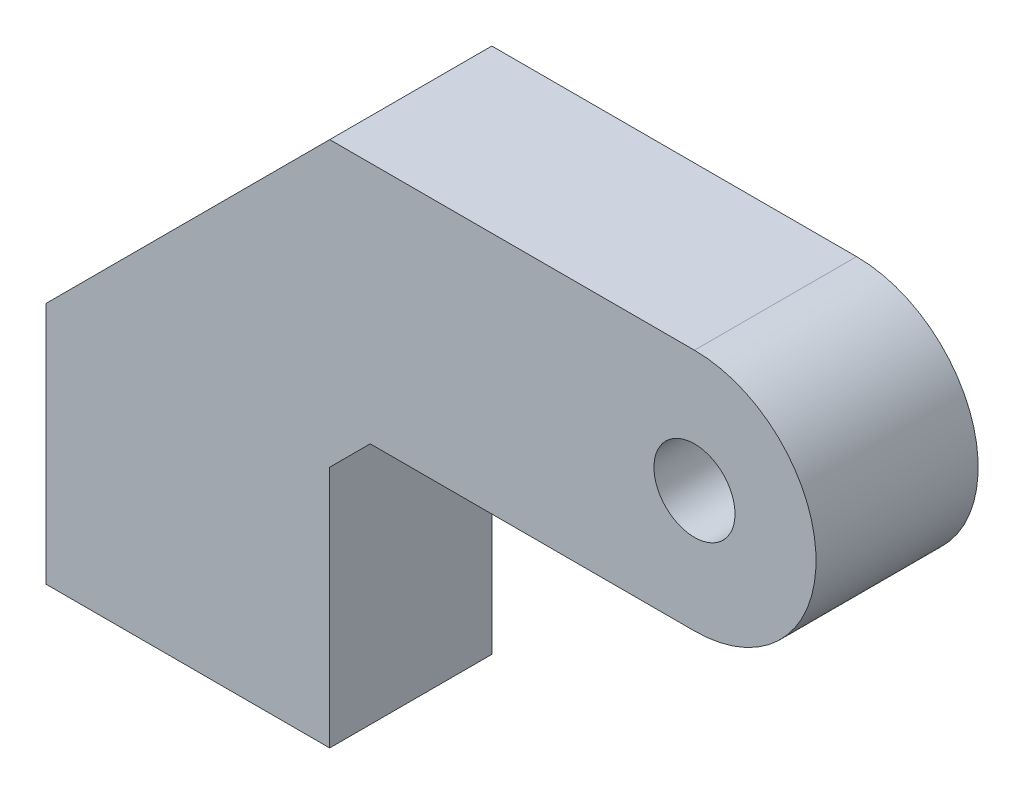
ISO-10303-21;
HEADER;
FILE_DESCRIPTION(('STEP AP214'),'2;1');
FILE_NAME('part.step','',(''),(''),'','','');
FILE_SCHEMA(('AUTOMOTIVE_DESIGN { 1 0 10303 214 1 1 1 1 }'));
ENDSEC;
DATA;
#1=APPLICATION_CONTEXT('core data for automotive mechanical design processes');
#2=APPLICATION_PROTOCOL_DEFINITION('international standard','automotive_design',2000,#1);
#3=PRODUCT_CONTEXT('',#1,'mechanical');
#4=PRODUCT('Part','Part','',(#3));
#5=PRODUCT_RELATED_PRODUCT_CATEGORY('part','',(#4));
#6=PRODUCT_DEFINITION_FORMATION('','',#4);
#7=PRODUCT_DEFINITION_CONTEXT('part definition',#1,'design');
#8=PRODUCT_DEFINITION('design','',#6,#7);
#9=PRODUCT_DEFINITION_SHAPE('','',#8);
#10=(LENGTH_UNIT() NAMED_UNIT(*) SI_UNIT(.MILLI.,.METRE.));
#11=(NAMED_UNIT(*) PLANE_ANGLE_UNIT() SI_UNIT($,.RADIAN.));
#12=(NAMED_UNIT(*) SI_UNIT($,.STERADIAN.) SOLID_ANGLE_UNIT());
#13=UNCERTAINTY_MEASURE_WITH_UNIT(LENGTH_MEASURE(1.E-05),#10,'distance_accuracy_value','');
#14=(GEOMETRIC_REPRESENTATION_CONTEXT(3) GLOBAL_UNCERTAINTY_ASSIGNED_CONTEXT((#13)) GLOBAL_UNIT_ASSIGNED_CONTEXT((#10,
#11,#12)) REPRESENTATION_CONTEXT('',''));
#15=CARTESIAN_POINT('',(0.,0.,0.));
#16=DIRECTION('',(0.,0.,1.));
#17=DIRECTION('',(1.,0.,0.));
#18=AXIS2_PLACEMENT_3D('',#15,#16,#17);
#19=CARTESIAN_POINT('',(7.,0.,8.));
#20=DIRECTION('',(-1.,0.,0.));
#21=DIRECTION('',(0.,-1.,0.));
#22=AXIS2_PLACEMENT_3D('',#19,#20,#21);
#23=PLANE('',#22);
#24=DIRECTION('',(0.,1.,0.));
#25=VECTOR('',#24,1.);
#26=CARTESIAN_POINT('',(7.,0.,0.));
#27=LINE('',#26,#25);
#28=CARTESIAN_POINT('',(7.,0.,0.));
#29=VERTEX_POINT('',#28);
#30=CARTESIAN_POINT('',(7.,12.,0.));
#31=VERTEX_POINT('',#30);
#32=EDGE_CURVE('E137',#29,#31,#27,.T.);
#33=ORIENTED_EDGE('',*,*,#32,.T.);
#34=DIRECTION('',(0.,0.,1.));
#35=VECTOR('',#34,1.);
#36=CARTESIAN_POINT('',(7.,12.,8.));
#37=LINE('',#36,#35);
#38=CARTESIAN_POINT('',(7.,12.,8.));
#39=VERTEX_POINT('',#38);
#40=EDGE_CURVE('E171',#31,#39,#37,.T.);
#41=ORIENTED_EDGE('',*,*,#40,.T.);
#42=DIRECTION('',(0.,1.,0.));
#43=VECTOR('',#42,1.);
#44=CARTESIAN_POINT('',(7.,0.,8.));
#45=LINE('',#44,#43);
#46=CARTESIAN_POINT('',(7.,0.,8.));
#47=VERTEX_POINT('',#46);
#48=EDGE_CURVE('E140',#47,#39,#45,.T.);
#49=ORIENTED_EDGE('',*,*,#48,.F.);
#50=DIRECTION('',(0.,0.,-1.));
#51=VECTOR('',#50,1.);
#52=CARTESIAN_POINT('',(7.,0.,8.));
#53=LINE('',#52,#51);
#54=EDGE_CURVE('E149',#47,#29,#53,.T.);
#55=ORIENTED_EDGE('',*,*,#54,.T.);
#56=EDGE_LOOP('',(#33,#41,#49,#55));
#57=FACE_BOUND('',#56,.T.);
#58=ADVANCED_FACE('F33',(#57),#23,.F.);
#59=CARTESIAN_POINT('',(7.,26.,8.));
#60=DIRECTION('',(0.,-1.,0.));
#61=DIRECTION('',(0.,0.,-1.));
#62=AXIS2_PLACEMENT_3D('',#59,#60,#61);
#63=PLANE('',#62);
#64=DIRECTION('',(-1.,0.,0.));
#65=VECTOR('',#64,1.);
#66=CARTESIAN_POINT('',(7.,26.,8.));
#67=LINE('',#66,#65);
#68=CARTESIAN_POINT('',(25.,26.,8.));
#69=VERTEX_POINT('',#68);
#70=CARTESIAN_POINT('',(7.00000000000004,26.,8.));
#71=VERTEX_POINT('',#70);
#72=EDGE_CURVE('E142',#69,#71,#67,.T.);
#73=ORIENTED_EDGE('',*,*,#72,.F.);
#74=DIRECTION('',(0.,0.,1.));
#75=VECTOR('',#74,1.);
#76=CARTESIAN_POINT('',(25.,26.,0.));
#77=LINE('',#76,#75);
#78=CARTESIAN_POINT('',(25.,26.,0.));
#79=VERTEX_POINT('',#78);
#80=EDGE_CURVE('E111',#79,#69,#77,.T.);
#81=ORIENTED_EDGE('',*,*,#80,.F.);
#82=DIRECTION('',(-1.,0.,0.));
#83=VECTOR('',#82,1.);
#84=CARTESIAN_POINT('',(7.,26.,0.));
#85=LINE('',#84,#83);
#86=CARTESIAN_POINT('',(7.00000000000004,26.,0.));
#87=VERTEX_POINT('',#86);
#88=EDGE_CURVE('E116',#79,#87,#85,.T.);
#89=ORIENTED_EDGE('',*,*,#88,.T.);
#90=DIRECTION('',(0.,0.,1.));
#91=VECTOR('',#90,1.);
#92=CARTESIAN_POINT('',(7.00000000000004,26.,8.));
#93=LINE('',#92,#91);
#94=EDGE_CURVE('E166',#87,#71,#93,.T.);
#95=ORIENTED_EDGE('',*,*,#94,.T.);
#96=EDGE_LOOP('',(#73,#81,#89,#95));
#97=FACE_BOUND('',#96,.T.);
#98=ADVANCED_FACE('F196',(#97),#63,.F.);
#99=CARTESIAN_POINT('',(-7.,0.,8.));
#100=DIRECTION('',(1.,0.,0.));
#101=DIRECTION('',(0.,1.,0.));
#102=AXIS2_PLACEMENT_3D('',#99,#100,#101);
#103=PLANE('',#102);
#104=DIRECTION('',(0.,-1.,0.));
#105=VECTOR('',#104,1.);
#106=CARTESIAN_POINT('',(-7.,0.,8.));
#107=LINE('',#106,#105);
#108=CARTESIAN_POINT('',(-7.,12.,8.));
#109=VERTEX_POINT('',#108);
#110=CARTESIAN_POINT('',(-7.,0.,8.));
#111=VERTEX_POINT('',#110);
#112=EDGE_CURVE('E145',#109,#111,#107,.T.);
#113=ORIENTED_EDGE('',*,*,#112,.F.);
#114=DIRECTION('',(0.,0.,-1.));
#115=VECTOR('',#114,1.);
#116=CARTESIAN_POINT('',(-7.,12.,8.));
#117=LINE('',#116,#115);
#118=CARTESIAN_POINT('',(-7.,12.,0.));
#119=VERTEX_POINT('',#118);
#120=EDGE_CURVE('E161',#109,#119,#117,.T.);
#121=ORIENTED_EDGE('',*,*,#120,.T.);
#122=DIRECTION('',(0.,-1.,0.));
#123=VECTOR('',#122,1.);
#124=CARTESIAN_POINT('',(-7.,0.,0.));
#125=LINE('',#124,#123);
#126=CARTESIAN_POINT('',(-7.,0.,0.));
#127=VERTEX_POINT('',#126);
#128=EDGE_CURVE('E153',#119,#127,#125,.T.);
#129=ORIENTED_EDGE('',*,*,#128,.T.);
#130=DIRECTION('',(0.,0.,-1.));
#131=VECTOR('',#130,1.);
#132=CARTESIAN_POINT('',(-7.,0.,8.));
#133=LINE('',#132,#131);
#134=EDGE_CURVE('E158',#111,#127,#133,.T.);
#135=ORIENTED_EDGE('',*,*,#134,.F.);
#136=EDGE_LOOP('',(#113,#121,#129,#135));
#137=FACE_BOUND('',#136,.T.);
#138=ADVANCED_FACE('F201',(#137),#103,.F.);
#139=CARTESIAN_POINT('',(-7.,0.,8.));
#140=DIRECTION('',(0.,1.,0.));
#141=DIRECTION('',(-1.,0.,0.));
#142=AXIS2_PLACEMENT_3D('',#139,#140,#141);
#143=PLANE('',#142);
#144=CARTESIAN_POINT('',(4.,0.,4.));
#145=DIRECTION('',(0.,-1.,0.));
#146=DIRECTION('',(-1.,0.,0.));
#147=AXIS2_PLACEMENT_3D('',#144,#145,#146);
#148=CIRCLE('',#147,1.25);
#149=CARTESIAN_POINT('',(2.75,0.,4.));
#150=VERTEX_POINT('',#149);
#151=EDGE_CURVE('E101',#150,#150,#148,.T.);
#152=ORIENTED_EDGE('',*,*,#151,.F.);
#153=EDGE_LOOP('',(#152));
#154=FACE_BOUND('',#153,.T.);
#155=CARTESIAN_POINT('',(-4.,0.,4.));
#156=DIRECTION('',(0.,-1.,0.));
#157=DIRECTION('',(1.,0.,0.));
#158=AXIS2_PLACEMENT_3D('',#155,#156,#157);
#159=CIRCLE('',#158,1.25);
#160=CARTESIAN_POINT('',(-2.75,0.,4.));
#161=VERTEX_POINT('',#160);
#162=EDGE_CURVE('E131',#161,#161,#159,.T.);
#163=ORIENTED_EDGE('',*,*,#162,.F.);
#164=EDGE_LOOP('',(#163));
#165=FACE_BOUND('',#164,.T.);
#166=DIRECTION('',(1.,0.,0.));
#167=VECTOR('',#166,1.);
#168=CARTESIAN_POINT('',(-7.,0.,0.));
#169=LINE('',#168,#167);
#170=EDGE_CURVE('E143',#127,#29,#169,.T.);
#171=ORIENTED_EDGE('',*,*,#170,.T.);
#172=ORIENTED_EDGE('',*,*,#54,.F.);
#173=DIRECTION('',(1.,0.,0.));
#174=VECTOR('',#173,1.);
#175=CARTESIAN_POINT('',(-7.,0.,8.));
#176=LINE('',#175,#174);
#177=EDGE_CURVE('E147',#111,#47,#176,.T.);
#178=ORIENTED_EDGE('',*,*,#177,.F.);
#179=ORIENTED_EDGE('',*,*,#134,.T.);
#180=EDGE_LOOP('',(#171,#172,#178,#179));
#181=FACE_BOUND('',#180,.T.);
#182=ADVANCED_FACE('F186',(#154,#165,#181),#143,.F.);
#183=CARTESIAN_POINT('',(0.,0.,8.));
#184=DIRECTION('',(0.,0.,1.));
#185=DIRECTION('',(1.,0.,0.));
#186=AXIS2_PLACEMENT_3D('',#183,#184,#185);
#187=PLANE('',#186);
#188=CARTESIAN_POINT('',(25.,20.,8.));
#189=DIRECTION('',(0.,0.,-1.));
#190=DIRECTION('',(-1.,0.,0.));
#191=AXIS2_PLACEMENT_3D('',#188,#189,#190);
#192=CIRCLE('',#191,6.00000000000001);
#193=CARTESIAN_POINT('',(25.,14.,8.));
#194=VERTEX_POINT('',#193);
#195=EDGE_CURVE('E110',#69,#194,#192,.T.);
#196=ORIENTED_EDGE('',*,*,#195,.F.);
#197=ORIENTED_EDGE('',*,*,#72,.T.);
#198=DIRECTION('',(0.707106781186549,0.707106781186546,0.));
#199=VECTOR('',#198,1.);
#200=CARTESIAN_POINT('',(-9.49999999999999,9.50000000000002,8.));
#201=LINE('',#200,#199);
#202=EDGE_CURVE('E169',#71,#109,#201,.F.);
#203=ORIENTED_EDGE('',*,*,#202,.T.);
#204=ORIENTED_EDGE('',*,*,#112,.T.);
#205=ORIENTED_EDGE('',*,*,#177,.T.);
#206=ORIENTED_EDGE('',*,*,#48,.T.);
#207=DIRECTION('',(0.707106781186543,0.707106781186552,0.));
#208=VECTOR('',#207,1.);
#209=CARTESIAN_POINT('',(7.,12.,8.));
#210=LINE('',#209,#208);
#211=CARTESIAN_POINT('',(9.,14.,8.));
#212=VERTEX_POINT('',#211);
#213=EDGE_CURVE('E41',#39,#212,#210,.T.);
#214=ORIENTED_EDGE('',*,*,#213,.T.);
#215=DIRECTION('',(1.,0.,0.));
#216=VECTOR('',#215,1.);
#217=CARTESIAN_POINT('',(7.,14.,8.));
#218=LINE('',#217,#216);
#219=EDGE_CURVE('E102',#212,#194,#218,.T.);
#220=ORIENTED_EDGE('',*,*,#219,.T.);
#221=EDGE_LOOP('',(#196,#197,#203,#204,#205,#206,#214,#220));
#222=FACE_BOUND('',#221,.T.);
#223=CARTESIAN_POINT('',(25.,20.,8.));
#224=DIRECTION('',(0.,0.,1.));
#225=DIRECTION('',(1.,0.,0.));
#226=AXIS2_PLACEMENT_3D('',#223,#224,#225);
#227=CIRCLE('',#226,2.);
#228=CARTESIAN_POINT('',(27.,20.,8.));
#229=VERTEX_POINT('',#228);
#230=EDGE_CURVE('E120',#229,#229,#227,.T.);
#231=ORIENTED_EDGE('',*,*,#230,.F.);
#232=EDGE_LOOP('',(#231));
#233=FACE_BOUND('',#232,.T.);
#234=ADVANCED_FACE('F179',(#222,#233),#187,.T.);
#235=CARTESIAN_POINT('',(0.,0.,0.));
#236=DIRECTION('',(0.,0.,1.));
#237=DIRECTION('',(1.,0.,0.));
#238=AXIS2_PLACEMENT_3D('',#235,#236,#237);
#239=PLANE('',#238);
#240=CARTESIAN_POINT('',(25.,20.,0.));
#241=DIRECTION('',(0.,0.,1.));
#242=DIRECTION('',(1.,0.,0.));
#243=AXIS2_PLACEMENT_3D('',#240,#241,#242);
#244=CIRCLE('',#243,2.);
#245=CARTESIAN_POINT('',(27.,20.,0.));
#246=VERTEX_POINT('',#245);
#247=EDGE_CURVE('E122',#246,#246,#244,.T.);
#248=ORIENTED_EDGE('',*,*,#247,.T.);
#249=EDGE_LOOP('',(#248));
#250=FACE_BOUND('',#249,.T.);
#251=ORIENTED_EDGE('',*,*,#88,.F.);
#252=CARTESIAN_POINT('',(25.,20.,0.));
#253=DIRECTION('',(0.,0.,-1.));
#254=DIRECTION('',(-1.,0.,0.));
#255=AXIS2_PLACEMENT_3D('',#252,#253,#254);
#256=CIRCLE('',#255,6.00000000000001);
#257=CARTESIAN_POINT('',(25.,14.,0.));
#258=VERTEX_POINT('',#257);
#259=EDGE_CURVE('E108',#79,#258,#256,.T.);
#260=ORIENTED_EDGE('',*,*,#259,.T.);
#261=DIRECTION('',(1.,0.,0.));
#262=VECTOR('',#261,1.);
#263=CARTESIAN_POINT('',(7.,14.,0.));
#264=LINE('',#263,#262);
#265=CARTESIAN_POINT('',(9.,14.,0.));
#266=VERTEX_POINT('',#265);
#267=EDGE_CURVE('E94',#266,#258,#264,.T.);
#268=ORIENTED_EDGE('',*,*,#267,.F.);
#269=DIRECTION('',(-0.707106781186543,-0.707106781186552,0.));
#270=VECTOR('',#269,1.);
#271=CARTESIAN_POINT('',(-2.49999999999994,2.49999999999991,0.));
#272=LINE('',#271,#270);
#273=EDGE_CURVE('E11',#266,#31,#272,.T.);
#274=ORIENTED_EDGE('',*,*,#273,.T.);
#275=ORIENTED_EDGE('',*,*,#32,.F.);
#276=ORIENTED_EDGE('',*,*,#170,.F.);
#277=ORIENTED_EDGE('',*,*,#128,.F.);
#278=DIRECTION('',(-0.707106781186549,-0.707106781186546,0.));
#279=VECTOR('',#278,1.);
#280=CARTESIAN_POINT('',(-7.,12.,0.));
#281=LINE('',#280,#279);
#282=EDGE_CURVE('E164',#119,#87,#281,.F.);
#283=ORIENTED_EDGE('',*,*,#282,.T.);
#284=EDGE_LOOP('',(#251,#260,#268,#274,#275,#276,#277,#283));
#285=FACE_BOUND('',#284,.T.);
#286=ADVANCED_FACE('F114',(#250,#285),#239,.F.);
#287=CARTESIAN_POINT('',(-4.,10.,4.));
#288=DIRECTION('',(0.,-1.,0.));
#289=DIRECTION('',(1.,0.,0.));
#290=AXIS2_PLACEMENT_3D('',#287,#288,#289);
#291=CYLINDRICAL_SURFACE('',#290,1.25);
#292=CARTESIAN_POINT('',(-4.,10.,4.));
#293=DIRECTION('',(0.,-1.,0.));
#294=DIRECTION('',(1.,0.,0.));
#295=AXIS2_PLACEMENT_3D('',#292,#293,#294);
#296=CIRCLE('',#295,1.25);
#297=CARTESIAN_POINT('',(-2.75,10.,4.));
#298=VERTEX_POINT('',#297);
#299=EDGE_CURVE('E134',#298,#298,#296,.T.);
#300=ORIENTED_EDGE('',*,*,#299,.F.);
#301=EDGE_LOOP('',(#300));
#302=FACE_BOUND('',#301,.T.);
#303=ORIENTED_EDGE('',*,*,#162,.T.);
#304=EDGE_LOOP('',(#303));
#305=FACE_BOUND('',#304,.T.);
#306=ADVANCED_FACE('F227',(#302,#305),#291,.F.);
#307=CARTESIAN_POINT('',(-4.,10.,4.));
#308=DIRECTION('',(0.,-1.,0.));
#309=DIRECTION('',(1.,0.,0.));
#310=AXIS2_PLACEMENT_3D('',#307,#308,#309);
#311=PLANE('',#310);
#312=ORIENTED_EDGE('',*,*,#299,.T.);
#313=EDGE_LOOP('',(#312));
#314=FACE_BOUND('',#313,.T.);
#315=ADVANCED_FACE('F233',(#314),#311,.T.);
#316=CARTESIAN_POINT('',(4.,10.,4.));
#317=DIRECTION('',(0.,-1.,0.));
#318=DIRECTION('',(1.,0.,0.));
#319=AXIS2_PLACEMENT_3D('',#316,#317,#318);
#320=CYLINDRICAL_SURFACE('',#319,1.25);
#321=CARTESIAN_POINT('',(4.,10.,4.));
#322=DIRECTION('',(0.,-1.,0.));
#323=DIRECTION('',(-1.,0.,0.));
#324=AXIS2_PLACEMENT_3D('',#321,#322,#323);
#325=CIRCLE('',#324,1.25);
#326=CARTESIAN_POINT('',(2.75,10.,4.));
#327=VERTEX_POINT('',#326);
#328=EDGE_CURVE('E128',#327,#327,#325,.T.);
#329=ORIENTED_EDGE('',*,*,#328,.F.);
#330=EDGE_LOOP('',(#329));
#331=FACE_BOUND('',#330,.T.);
#332=ORIENTED_EDGE('',*,*,#151,.T.);
#333=EDGE_LOOP('',(#332));
#334=FACE_BOUND('',#333,.T.);
#335=ADVANCED_FACE('F237',(#331,#334),#320,.F.);
#336=CARTESIAN_POINT('',(4.,10.,4.));
#337=DIRECTION('',(0.,1.,0.));
#338=DIRECTION('',(-1.,0.,0.));
#339=AXIS2_PLACEMENT_3D('',#336,#337,#338);
#340=PLANE('',#339);
#341=ORIENTED_EDGE('',*,*,#328,.T.);
#342=EDGE_LOOP('',(#341));
#343=FACE_BOUND('',#342,.T.);
#344=ADVANCED_FACE('F241',(#343),#340,.F.);
#345=CARTESIAN_POINT('',(7.,14.,0.));
#346=DIRECTION('',(0.,-1.,0.));
#347=DIRECTION('',(1.,0.,0.));
#348=AXIS2_PLACEMENT_3D('',#345,#346,#347);
#349=PLANE('',#348);
#350=ORIENTED_EDGE('',*,*,#219,.F.);
#351=DIRECTION('',(0.,0.,-1.));
#352=VECTOR('',#351,1.);
#353=CARTESIAN_POINT('',(9.,14.,0.));
#354=LINE('',#353,#352);
#355=EDGE_CURVE('E48',#212,#266,#354,.T.);
#356=ORIENTED_EDGE('',*,*,#355,.T.);
#357=ORIENTED_EDGE('',*,*,#267,.T.);
#358=DIRECTION('',(0.,0.,1.));
#359=VECTOR('',#358,1.);
#360=CARTESIAN_POINT('',(25.,14.,0.));
#361=LINE('',#360,#359);
#362=EDGE_CURVE('E97',#258,#194,#361,.T.);
#363=ORIENTED_EDGE('',*,*,#362,.T.);
#364=EDGE_LOOP('',(#350,#356,#357,#363));
#365=FACE_BOUND('',#364,.T.);
#366=ADVANCED_FACE('F96',(#365),#349,.T.);
#367=CARTESIAN_POINT('',(25.,20.,0.));
#368=DIRECTION('',(0.,0.,1.));
#369=DIRECTION('',(1.,0.,0.));
#370=AXIS2_PLACEMENT_3D('',#367,#368,#369);
#371=CYLINDRICAL_SURFACE('',#370,2.);
#372=ORIENTED_EDGE('',*,*,#247,.F.);
#373=EDGE_LOOP('',(#372));
#374=FACE_BOUND('',#373,.T.);
#375=ORIENTED_EDGE('',*,*,#230,.T.);
#376=EDGE_LOOP('',(#375));
#377=FACE_BOUND('',#376,.T.);
#378=ADVANCED_FACE('F206',(#374,#377),#371,.F.);
#379=CARTESIAN_POINT('',(-7.,12.,8.));
#380=DIRECTION('',(0.707106781186546,-0.707106781186549,0.));
#381=DIRECTION('',(0.,0.,-1.));
#382=AXIS2_PLACEMENT_3D('',#379,#380,#381);
#383=PLANE('',#382);
#384=ORIENTED_EDGE('',*,*,#202,.F.);
#385=ORIENTED_EDGE('',*,*,#94,.F.);
#386=ORIENTED_EDGE('',*,*,#282,.F.);
#387=ORIENTED_EDGE('',*,*,#120,.F.);
#388=EDGE_LOOP('',(#384,#385,#386,#387));
#389=FACE_BOUND('',#388,.T.);
#390=ADVANCED_FACE('F193',(#389),#383,.F.);
#391=CARTESIAN_POINT('',(25.,20.,0.));
#392=DIRECTION('',(0.,0.,1.));
#393=DIRECTION('',(1.,0.,0.));
#394=AXIS2_PLACEMENT_3D('',#391,#392,#393);
#395=CYLINDRICAL_SURFACE('',#394,6.00000000000001);
#396=ORIENTED_EDGE('',*,*,#195,.T.);
#397=ORIENTED_EDGE('',*,*,#362,.F.);
#398=ORIENTED_EDGE('',*,*,#259,.F.);
#399=ORIENTED_EDGE('',*,*,#80,.T.);
#400=EDGE_LOOP('',(#396,#397,#398,#399));
#401=FACE_BOUND('',#400,.T.);
#402=ADVANCED_FACE('F106',(#401),#395,.T.);
#403=CARTESIAN_POINT('',(7.,12.,8.));
#404=DIRECTION('',(-0.707106781186552,0.707106781186543,0.));
#405=DIRECTION('',(0.,0.,1.));
#406=AXIS2_PLACEMENT_3D('',#403,#404,#405);
#407=PLANE('',#406);
#408=ORIENTED_EDGE('',*,*,#273,.F.);
#409=ORIENTED_EDGE('',*,*,#355,.F.);
#410=ORIENTED_EDGE('',*,*,#213,.F.);
#411=ORIENTED_EDGE('',*,*,#40,.F.);
#412=EDGE_LOOP('',(#408,#409,#410,#411));
#413=FACE_BOUND('',#412,.T.);
#414=ADVANCED_FACE('F35',(#413),#407,.F.);
#415=CLOSED_SHELL('',(#58,#98,#138,#182,#234,#286,#306,#315,#335,#344,#366,#378,#390,#402,#414));
#416=MANIFOLD_SOLID_BREP('B2',#415);
#417=ADVANCED_BREP_SHAPE_REPRESENTATION('',(#18,#416),#14);
#418=SHAPE_DEFINITION_REPRESENTATION(#9,#417);
ENDSEC;
END-ISO-10303-21;
